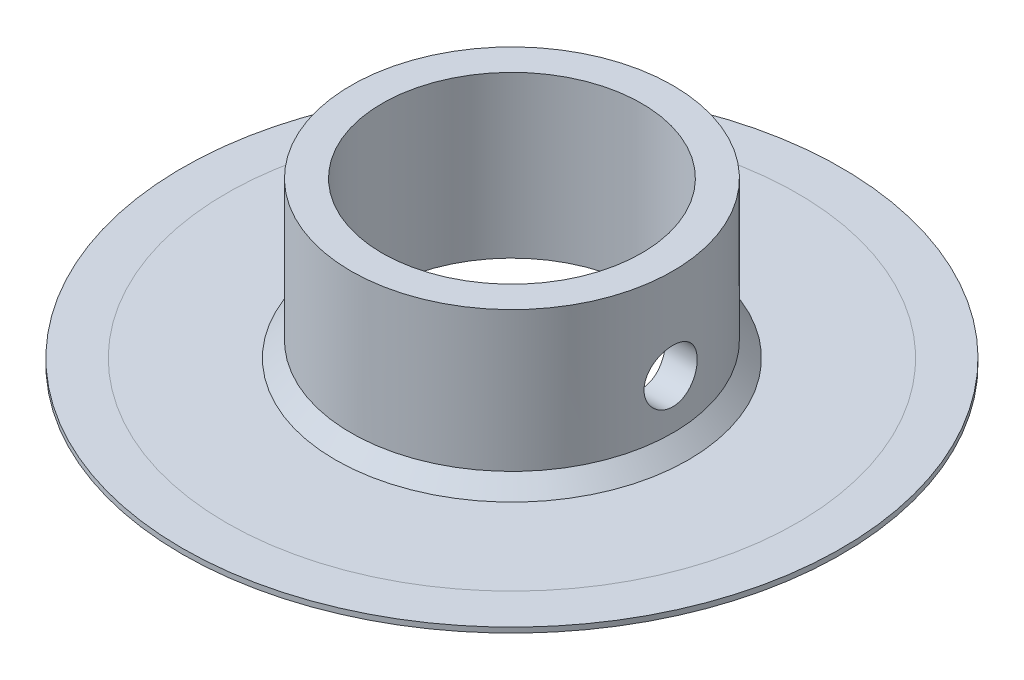
ISO-10303-21;
HEADER;
FILE_DESCRIPTION(('STEP AP214'),'2;1');
FILE_NAME('part.step','',(''),(''),'','','');
FILE_SCHEMA(('AUTOMOTIVE_DESIGN { 1 0 10303 214 1 1 1 1 }'));
ENDSEC;
DATA;
#1=APPLICATION_CONTEXT('core data for automotive mechanical design processes');
#2=APPLICATION_PROTOCOL_DEFINITION('international standard','automotive_design',2000,#1);
#3=PRODUCT_CONTEXT('',#1,'mechanical');
#4=PRODUCT('Part','Part','',(#3));
#5=PRODUCT_RELATED_PRODUCT_CATEGORY('part','',(#4));
#6=PRODUCT_DEFINITION_FORMATION('','',#4);
#7=PRODUCT_DEFINITION_CONTEXT('part definition',#1,'design');
#8=PRODUCT_DEFINITION('design','',#6,#7);
#9=PRODUCT_DEFINITION_SHAPE('','',#8);
#10=(LENGTH_UNIT() NAMED_UNIT(*) SI_UNIT(.MILLI.,.METRE.));
#11=(NAMED_UNIT(*) PLANE_ANGLE_UNIT() SI_UNIT($,.RADIAN.));
#12=(NAMED_UNIT(*) SI_UNIT($,.STERADIAN.) SOLID_ANGLE_UNIT());
#13=UNCERTAINTY_MEASURE_WITH_UNIT(LENGTH_MEASURE(1.E-05),#10,'distance_accuracy_value','');
#14=(GEOMETRIC_REPRESENTATION_CONTEXT(3) GLOBAL_UNCERTAINTY_ASSIGNED_CONTEXT((#13)) GLOBAL_UNIT_ASSIGNED_CONTEXT((#10,
#11,#12)) REPRESENTATION_CONTEXT('',''));
#15=CARTESIAN_POINT('',(0.,0.,0.));
#16=DIRECTION('',(0.,0.,1.));
#17=DIRECTION('',(1.,0.,0.));
#18=AXIS2_PLACEMENT_3D('',#15,#16,#17);
#19=CARTESIAN_POINT('',(0.,0.2,0.));
#20=DIRECTION('',(0.,1.,0.));
#21=DIRECTION('',(0.,0.,1.));
#22=AXIS2_PLACEMENT_3D('',#19,#20,#21);
#23=PLANE('',#22);
#24=CARTESIAN_POINT('',(0.,0.2,0.));
#25=DIRECTION('',(0.,1.,0.));
#26=DIRECTION('',(0.,0.,1.));
#27=AXIS2_PLACEMENT_3D('',#24,#25,#26);
#28=CIRCLE('',#27,12.7);
#29=CARTESIAN_POINT('',(0.,0.2,12.7));
#30=VERTEX_POINT('',#29);
#31=EDGE_CURVE('E55',#30,#30,#28,.T.);
#32=ORIENTED_EDGE('',*,*,#31,.T.);
#33=EDGE_LOOP('',(#32));
#34=FACE_BOUND('',#33,.T.);
#35=CARTESIAN_POINT('',(0.,0.2,0.));
#36=DIRECTION('',(0.,1.,0.));
#37=DIRECTION('',(0.,0.,1.));
#38=AXIS2_PLACEMENT_3D('',#35,#36,#37);
#39=CIRCLE('',#38,11.);
#40=CARTESIAN_POINT('',(0.,0.2,11.));
#41=VERTEX_POINT('',#40);
#42=EDGE_CURVE('E10',#41,#41,#39,.F.);
#43=ORIENTED_EDGE('',*,*,#42,.T.);
#44=EDGE_LOOP('',(#43));
#45=FACE_BOUND('',#44,.T.);
#46=ADVANCED_FACE('F37',(#34,#45),#23,.T.);
#47=CARTESIAN_POINT('',(0.,0.2,0.));
#48=DIRECTION('',(0.,-1.,0.));
#49=DIRECTION('',(0.,0.,-1.));
#50=AXIS2_PLACEMENT_3D('',#47,#48,#49);
#51=CYLINDRICAL_SURFACE('',#50,12.7);
#52=ORIENTED_EDGE('',*,*,#31,.F.);
#53=EDGE_LOOP('',(#52));
#54=FACE_BOUND('',#53,.T.);
#55=CARTESIAN_POINT('',(0.,0.,0.));
#56=DIRECTION('',(0.,1.,0.));
#57=DIRECTION('',(0.,0.,1.));
#58=AXIS2_PLACEMENT_3D('',#55,#56,#57);
#59=CIRCLE('',#58,12.7);
#60=CARTESIAN_POINT('',(0.,0.,12.7));
#61=VERTEX_POINT('',#60);
#62=EDGE_CURVE('E58',#61,#61,#59,.T.);
#63=ORIENTED_EDGE('',*,*,#62,.T.);
#64=EDGE_LOOP('',(#63));
#65=FACE_BOUND('',#64,.T.);
#66=ADVANCED_FACE('F110',(#54,#65),#51,.T.);
#67=ORIENTED_EDGE('',*,*,#42,.F.);
#68=EDGE_LOOP('',(#67));
#69=FACE_BOUND('',#68,.T.);
#70=CARTESIAN_POINT('',(0.,0.2,0.));
#71=DIRECTION('',(0.,1.,0.));
#72=DIRECTION('',(0.,0.,1.));
#73=AXIS2_PLACEMENT_3D('',#70,#71,#72);
#74=CIRCLE('',#73,6.79999999999999);
#75=CARTESIAN_POINT('',(0.,0.2,6.79999999999999));
#76=VERTEX_POINT('',#75);
#77=EDGE_CURVE('E45',#76,#76,#74,.F.);
#78=ORIENTED_EDGE('',*,*,#77,.T.);
#79=EDGE_LOOP('',(#78));
#80=FACE_BOUND('',#79,.T.);
#81=ADVANCED_FACE('F112',(#69,#80),#23,.T.);
#82=CARTESIAN_POINT('',(0.,0.,0.));
#83=DIRECTION('',(0.,1.,0.));
#84=DIRECTION('',(0.,0.,1.));
#85=AXIS2_PLACEMENT_3D('',#82,#83,#84);
#86=PLANE('',#85);
#87=CARTESIAN_POINT('',(0.,0.,0.));
#88=DIRECTION('',(0.,1.,0.));
#89=DIRECTION('',(0.,0.,1.));
#90=AXIS2_PLACEMENT_3D('',#87,#88,#89);
#91=CIRCLE('',#90,5.);
#92=CARTESIAN_POINT('',(0.,0.,5.));
#93=VERTEX_POINT('',#92);
#94=EDGE_CURVE('E66',#93,#93,#91,.T.);
#95=ORIENTED_EDGE('',*,*,#94,.T.);
#96=EDGE_LOOP('',(#95));
#97=FACE_BOUND('',#96,.T.);
#98=ORIENTED_EDGE('',*,*,#62,.F.);
#99=EDGE_LOOP('',(#98));
#100=FACE_BOUND('',#99,.T.);
#101=ADVANCED_FACE('F105',(#97,#100),#86,.F.);
#102=CARTESIAN_POINT('',(0.,6.2,0.));
#103=DIRECTION('',(0.,-1.,0.));
#104=DIRECTION('',(0.,0.,-1.));
#105=AXIS2_PLACEMENT_3D('',#102,#103,#104);
#106=CYLINDRICAL_SURFACE('',#105,6.2);
#107=CARTESIAN_POINT('',(6.11468519222372,2.7,-1.02499999999999));
#108=CARTESIAN_POINT('',(6.11468621834878,2.64284899857778,-1.02499769733902));
#109=CARTESIAN_POINT('',(6.11549511921186,2.58566662172223,-1.02020395573959));
#110=CARTESIAN_POINT('',(6.11864043632118,2.47290582598775,-1.00116370877257));
#111=CARTESIAN_POINT('',(6.12097826807639,2.41732894333744,-0.986908443591222));
#112=CARTESIAN_POINT('',(6.12690959263376,2.30942737988513,-0.949387751557226));
#113=CARTESIAN_POINT('',(6.13050204304009,2.25710004158844,-0.926129802822118));
#114=CARTESIAN_POINT('',(6.13853659287519,2.15709620096999,-0.871282490355476));
#115=CARTESIAN_POINT('',(6.14297859487991,2.10941916631093,-0.839694081779112));
#116=CARTESIAN_POINT('',(6.15225989704329,2.01960098294758,-0.768755625166493));
#117=CARTESIAN_POINT('',(6.15710231168028,1.97751148978985,-0.729340572496074));
#118=CARTESIAN_POINT('',(6.16661114251174,1.90051173656749,-0.644008145244442));
#119=CARTESIAN_POINT('',(6.17127754832712,1.86560189934132,-0.598090387961887));
#120=CARTESIAN_POINT('',(6.17994151048768,1.80375882295949,-0.500721606589131));
#121=CARTESIAN_POINT('',(6.18393497929933,1.77687361624094,-0.449239680284478));
#122=CARTESIAN_POINT('',(6.19076846692061,1.7321516666367,-0.342413412475257));
#123=CARTESIAN_POINT('',(6.19360855953399,1.71431434476489,-0.287069318373802));
#124=CARTESIAN_POINT('',(6.19779330823486,1.68835237391988,-0.174623264327099));
#125=CARTESIAN_POINT('',(6.19915131599478,1.68014095726412,-0.117541842627033));
#126=CARTESIAN_POINT('',(6.20026474756261,1.67339411093436,-0.00279635980400497));
#127=CARTESIAN_POINT('',(6.20002027862671,1.67485803367524,0.0548676620667046));
#128=CARTESIAN_POINT('',(6.19796687946073,1.68735257581307,0.168548328677381));
#129=CARTESIAN_POINT('',(6.19617321974376,1.69828981881294,0.224575551583191));
#130=CARTESIAN_POINT('',(6.19124000145266,1.7292735377972,0.333988399842735));
#131=CARTESIAN_POINT('',(6.18810040240485,1.74932028771429,0.387373945704855));
#132=CARTESIAN_POINT('',(6.18080205390846,1.79804700141481,0.490266132122608));
#133=CARTESIAN_POINT('',(6.17663876979775,1.82676551161131,0.539754183470166));
#134=CARTESIAN_POINT('',(6.16775571907501,1.89199230017465,0.633243985606351));
#135=CARTESIAN_POINT('',(6.16303590814382,1.92850119911906,0.677245298882126));
#136=CARTESIAN_POINT('',(6.15349832119461,2.00879050567103,0.759064172945987));
#137=CARTESIAN_POINT('',(6.14868004831722,2.05265251744915,0.796801641216312));
#138=CARTESIAN_POINT('',(6.13954312198001,2.14612781877588,0.864394108645959));
#139=CARTESIAN_POINT('',(6.13522447298674,2.19574115973235,0.894249037339917));
#140=CARTESIAN_POINT('',(6.12757554662004,2.29940287610074,0.945244286168177));
#141=CARTESIAN_POINT('',(6.12424635060234,2.35345602198297,0.966375081590494));
#142=CARTESIAN_POINT('',(6.118971273478,2.46441187593744,0.99923480234979));
#143=CARTESIAN_POINT('',(6.11702527264859,2.52131433693006,1.0109645414086));
#144=CARTESIAN_POINT('',(6.11476004437147,2.63563729353179,1.02457665174229));
#145=CARTESIAN_POINT('',(6.11442196571342,2.69304383992667,1.02657314219478));
#146=CARTESIAN_POINT('',(6.11536066251605,2.80737092610743,1.02096608203965));
#147=CARTESIAN_POINT('',(6.11663737664852,2.86429148426799,1.01336289601808));
#148=CARTESIAN_POINT('',(6.1206443969546,2.97566907502398,0.988869564701533));
#149=CARTESIAN_POINT('',(6.12336562410887,3.03013921458202,0.972037403642339));
#150=CARTESIAN_POINT('',(6.12994744861854,3.13548553328628,0.929624697128855));
#151=CARTESIAN_POINT('',(6.13380811314534,3.18636150033185,0.904043635900667));
#152=CARTESIAN_POINT('',(6.14227766547897,3.28358349713881,0.844589535580707));
#153=CARTESIAN_POINT('',(6.14689302980851,3.32988419286276,0.810643303393374));
#154=CARTESIAN_POINT('',(6.15633295540963,3.41617287956669,0.735523038828991));
#155=CARTESIAN_POINT('',(6.1611575311324,3.45616043358038,0.694348506558861));
#156=CARTESIAN_POINT('',(6.17053183913415,3.52910387591784,0.605435091854494));
#157=CARTESIAN_POINT('',(6.17507825739849,3.5619836988586,0.557633404058592));
#158=CARTESIAN_POINT('',(6.18333096339146,3.61924578306582,0.457118552207727));
#159=CARTESIAN_POINT('',(6.18703727795563,3.64362831577571,0.404405545111604));
#160=CARTESIAN_POINT('',(6.19317776137465,3.68308505344424,0.295791325830294));
#161=CARTESIAN_POINT('',(6.19561738369889,3.69819921318813,0.239904949709854));
#162=CARTESIAN_POINT('',(6.19897264523866,3.71881887918247,0.12634362045257));
#163=CARTESIAN_POINT('',(6.19988840775023,3.72432516281144,0.06866881240308));
#164=CARTESIAN_POINT('',(6.20009106808783,3.72555068972458,-0.0460977312736879));
#165=CARTESIAN_POINT('',(6.19939723706189,3.72138572322694,-0.103188229607228));
#166=CARTESIAN_POINT('',(6.19649797017694,3.70363723682134,-0.215844701731178));
#167=CARTESIAN_POINT('',(6.19429254245271,3.6900537675997,-0.271410683724206));
#168=CARTESIAN_POINT('',(6.18861699164192,3.65389801544683,-0.379397635323583));
#169=CARTESIAN_POINT('',(6.1851482325484,3.6313354246629,-0.431821926125598));
#170=CARTESIAN_POINT('',(6.17732487907575,3.57787474395315,-0.532158657610738));
#171=CARTESIAN_POINT('',(6.17297024379937,3.54697626917235,-0.580070889841226));
#172=CARTESIAN_POINT('',(6.1637961455635,3.47730973511736,-0.670607081239796));
#173=CARTESIAN_POINT('',(6.15897199268893,3.43845682400909,-0.713165279630289));
#174=CARTESIAN_POINT('',(6.14943523164716,3.35416243411005,-0.791198905655186));
#175=CARTESIAN_POINT('',(6.1447226498716,3.30871941421928,-0.82667267196658));
#176=CARTESIAN_POINT('',(6.13590726012375,3.21216017977479,-0.889756501126194));
#177=CARTESIAN_POINT('',(6.13180891576498,3.16100674604317,-0.917310221820288));
#178=CARTESIAN_POINT('',(6.12473874305774,3.05475088141037,-0.963391642796003));
#179=CARTESIAN_POINT('',(6.12176578628566,2.99965247241931,-0.981928389722952));
#180=CARTESIAN_POINT('',(6.11794465253936,2.90361388063432,-1.00540858799));
#181=CARTESIAN_POINT('',(6.11672912463853,2.86325623039843,-1.01274362660137));
#182=CARTESIAN_POINT('',(6.11509903369655,2.78193775616185,-1.02254011503201));
#183=CARTESIAN_POINT('',(6.11468445649789,2.74097694283549,-1.02500165099481));
#184=CARTESIAN_POINT('',(6.11468519222372,2.7,-1.02499999999999));
#185=B_SPLINE_CURVE_WITH_KNOTS('',3,(#107,#108,#109,#110,#111,#112,#113,#114,#115,#116,#117,
#118,#119,#120,#121,#122,#123,#124,#125,#126,#127,#128,#129,#130,#131,#132,#133,#134,#135,#136,
#137,#138,#139,#140,#141,#142,#143,#144,#145,#146,#147,#148,#149,#150,#151,#152,#153,#154,#155,
#156,#157,#158,#159,#160,#161,#162,#163,#164,#165,#166,#167,#168,#169,#170,#171,#172,#173,#174,
#175,#176,#177,#178,#179,#180,#181,#182,#183,#184),.UNSPECIFIED.,.T.,.F.,(4,2,2,2,2,2,2,2,2,2,2,
2,2,2,2,2,2,2,2,2,2,2,2,2,2,2,2,2,2,2,2,2,2,2,2,2,2,2,4),(0.,0.171303164784234,
0.342765149752583,0.514085013675939,0.685385242913409,0.858172679931962,1.03097029017688,
1.20478236501028,1.37858331597562,1.55080527988997,1.72301571684438,1.89354778511082,
2.06408498179985,2.23539167191349,2.40671201331029,2.58007757685421,2.75344469013395,
2.92700058238233,3.10054145063031,3.27204263271111,3.44353730154555,3.61396664100292,
3.78440602951326,3.95639324725802,4.12839236394347,4.30214986213834,4.47590180919209,
4.64889936904837,4.82188293092795,4.99280612201056,5.16372839326537,5.33446666767845,
5.50521282616501,5.67788534396803,5.85059830662917,6.02451112718896,6.19824910090722,
6.32107466642879,6.44389806087895),.UNSPECIFIED.);
#186=CARTESIAN_POINT('',(6.11468519222372,2.7,-1.02499999999999));
#187=VERTEX_POINT('',#186);
#188=EDGE_CURVE('E70',#187,#187,#185,.T.);
#189=ORIENTED_EDGE('',*,*,#188,.T.);
#190=EDGE_LOOP('',(#189));
#191=FACE_BOUND('',#190,.T.);
#192=CARTESIAN_POINT('',(0.,0.799999999999985,0.));
#193=DIRECTION('',(0.,-1.,0.));
#194=DIRECTION('',(0.,0.,-1.));
#195=AXIS2_PLACEMENT_3D('',#192,#193,#194);
#196=CIRCLE('',#195,6.2);
#197=CARTESIAN_POINT('',(0.,0.799999999999985,-6.2));
#198=VERTEX_POINT('',#197);
#199=EDGE_CURVE('E51',#198,#198,#196,.F.);
#200=ORIENTED_EDGE('',*,*,#199,.T.);
#201=EDGE_LOOP('',(#200));
#202=FACE_BOUND('',#201,.T.);
#203=CARTESIAN_POINT('',(0.,6.2,0.));
#204=DIRECTION('',(0.,1.,0.));
#205=DIRECTION('',(0.,0.,1.));
#206=AXIS2_PLACEMENT_3D('',#203,#204,#205);
#207=CIRCLE('',#206,6.2);
#208=CARTESIAN_POINT('',(0.,6.2,6.2));
#209=VERTEX_POINT('',#208);
#210=EDGE_CURVE('E61',#209,#209,#207,.T.);
#211=ORIENTED_EDGE('',*,*,#210,.F.);
#212=EDGE_LOOP('',(#211));
#213=FACE_BOUND('',#212,.T.);
#214=ADVANCED_FACE('F83',(#191,#202,#213),#106,.T.);
#215=CARTESIAN_POINT('',(0.,6.2,0.));
#216=DIRECTION('',(0.,1.,0.));
#217=DIRECTION('',(0.,0.,1.));
#218=AXIS2_PLACEMENT_3D('',#215,#216,#217);
#219=PLANE('',#218);
#220=CARTESIAN_POINT('',(0.,6.2,0.));
#221=DIRECTION('',(0.,1.,0.));
#222=DIRECTION('',(0.,0.,1.));
#223=AXIS2_PLACEMENT_3D('',#220,#221,#222);
#224=CIRCLE('',#223,5.);
#225=CARTESIAN_POINT('',(0.,6.2,5.));
#226=VERTEX_POINT('',#225);
#227=EDGE_CURVE('E67',#226,#226,#224,.T.);
#228=ORIENTED_EDGE('',*,*,#227,.F.);
#229=EDGE_LOOP('',(#228));
#230=FACE_BOUND('',#229,.T.);
#231=ORIENTED_EDGE('',*,*,#210,.T.);
#232=EDGE_LOOP('',(#231));
#233=FACE_BOUND('',#232,.T.);
#234=ADVANCED_FACE('F97',(#230,#233),#219,.T.);
#235=CARTESIAN_POINT('',(0.,1.,0.));
#236=DIRECTION('',(0.,-1.,0.));
#237=DIRECTION('',(0.,0.,-1.));
#238=AXIS2_PLACEMENT_3D('',#235,#236,#237);
#239=CONICAL_SURFACE('',#238,5.99999999999998,0.785398163397453);
#240=ORIENTED_EDGE('',*,*,#77,.F.);
#241=EDGE_LOOP('',(#240));
#242=FACE_BOUND('',#241,.T.);
#243=ORIENTED_EDGE('',*,*,#199,.F.);
#244=EDGE_LOOP('',(#243));
#245=FACE_BOUND('',#244,.T.);
#246=ADVANCED_FACE('F39',(#242,#245),#239,.T.);
#247=CARTESIAN_POINT('',(0.,0.,0.));
#248=DIRECTION('',(0.,1.,0.));
#249=DIRECTION('',(0.,0.,1.));
#250=AXIS2_PLACEMENT_3D('',#247,#248,#249);
#251=CYLINDRICAL_SURFACE('',#250,5.);
#252=CARTESIAN_POINT('',(4.89380986553421,2.7,-1.02499999999999));
#253=CARTESIAN_POINT('',(4.8938110057621,2.75692184364766,-1.02499793130721));
#254=CARTESIAN_POINT('',(4.89481378990575,2.81386942664678,-1.02024228549257));
#255=CARTESIAN_POINT('',(4.89871030405494,2.92615139358604,-1.00136248503081));
#256=CARTESIAN_POINT('',(4.9016055092218,2.98148448383301,-0.987231021709743));
#257=CARTESIAN_POINT('',(4.90894550175205,3.08889685398785,-0.95005802907127));
#258=CARTESIAN_POINT('',(4.91338870641792,3.14097939341962,-0.927025597617711));
#259=CARTESIAN_POINT('',(4.92332217241195,3.24054030217505,-0.872729687713656));
#260=CARTESIAN_POINT('',(4.92881238491396,3.28801888604388,-0.841466593066036));
#261=CARTESIAN_POINT('',(4.94031235217697,3.37773129029778,-0.771101871906856));
#262=CARTESIAN_POINT('',(4.94632805581705,3.41988678022481,-0.731901332944746));
#263=CARTESIAN_POINT('',(4.95814890174971,3.49707195425185,-0.646988147012741));
#264=CARTESIAN_POINT('',(4.96395402885357,3.53210112517197,-0.601275031462478));
#265=CARTESIAN_POINT('',(4.97476396692358,3.59434480073779,-0.50411391856832));
#266=CARTESIAN_POINT('',(4.97976094371786,3.62148463286862,-0.452617137848568));
#267=CARTESIAN_POINT('',(4.98832463455805,3.66669705714557,-0.345674729621281));
#268=CARTESIAN_POINT('',(4.99189148932217,3.68477054142757,-0.29022949125851));
#269=CARTESIAN_POINT('',(4.99715101783892,3.71109273237502,-0.177777387771844));
#270=CARTESIAN_POINT('',(4.99886891641,3.71947379119316,-0.12080270245156));
#271=CARTESIAN_POINT('',(5.0003241629717,3.72658638352546,-0.00623178721856188));
#272=CARTESIAN_POINT('',(5.00006171106104,3.72531889194905,0.0513643793111704));
#273=CARTESIAN_POINT('',(4.99760530469913,3.71327027901569,0.164633093683833));
#274=CARTESIAN_POINT('',(4.99544030031358,3.70263174577533,0.220321528339864));
#275=CARTESIAN_POINT('',(4.98945478299076,3.67236947551435,0.329105605994237));
#276=CARTESIAN_POINT('',(4.98563420148153,3.65274536632043,0.382201141496551));
#277=CARTESIAN_POINT('',(4.97671939611424,3.60493845906525,0.484696168674203));
#278=CARTESIAN_POINT('',(4.97161696816092,3.57670026948439,0.534069081240158));
#279=CARTESIAN_POINT('',(4.96070018656929,3.51250784698684,0.627428202203324));
#280=CARTESIAN_POINT('',(4.95488574711571,3.47655268358705,0.671413760008536));
#281=CARTESIAN_POINT('',(4.94306086217348,3.3971662374192,0.753596275428009));
#282=CARTESIAN_POINT('',(4.93704877703615,3.35361015921131,0.79167254313405));
#283=CARTESIAN_POINT('',(4.92560682850159,3.26066970620968,0.860000671649432));
#284=CARTESIAN_POINT('',(4.92017697726181,3.21128520975958,0.890252369094729));
#285=CARTESIAN_POINT('',(4.91051075816983,3.10791082322015,0.942117317518955));
#286=CARTESIAN_POINT('',(4.90627721277129,3.05391042702409,0.963710189096989));
#287=CARTESIAN_POINT('',(4.89952370117187,2.94294094211076,0.997480378760953));
#288=CARTESIAN_POINT('',(4.89700349927218,2.88597226289139,1.00965899196581));
#289=CARTESIAN_POINT('',(4.89400946662045,2.77177951842831,1.02407282354529));
#290=CARTESIAN_POINT('',(4.89349969494809,2.71457841702024,1.02648270187056));
#291=CARTESIAN_POINT('',(4.89448764317553,2.60059163331306,1.0217613948332));
#292=CARTESIAN_POINT('',(4.89598524308533,2.54380592638786,1.01463077975053));
#293=CARTESIAN_POINT('',(4.90078546195405,2.43285437170472,0.991181728225227));
#294=CARTESIAN_POINT('',(4.90406959125894,2.37866777105559,0.974957356125928));
#295=CARTESIAN_POINT('',(4.91205649685424,2.27378198027643,0.93388224578884));
#296=CARTESIAN_POINT('',(4.91675939500817,2.22308309017888,0.909030766507865));
#297=CARTESIAN_POINT('',(4.92713422401412,2.12584978427293,0.85101425816063));
#298=CARTESIAN_POINT('',(4.93281850602254,2.07938166064694,0.81774037847768));
#299=CARTESIAN_POINT('',(4.94448208465937,1.99262475565841,0.743967994365467));
#300=CARTESIAN_POINT('',(4.95046141321375,1.95233664496051,0.703468706853817));
#301=CARTESIAN_POINT('',(4.96215848749079,1.87841712074459,0.615609413260678));
#302=CARTESIAN_POINT('',(4.96787042981155,1.8449040585122,0.568148934280834));
#303=CARTESIAN_POINT('',(4.97828676453437,1.78632717948164,0.468170064192647));
#304=CARTESIAN_POINT('',(4.98299120058534,1.76126299661972,0.415651892345245));
#305=CARTESIAN_POINT('',(4.99083775785138,1.72046588602684,0.307352979081922));
#306=CARTESIAN_POINT('',(4.99398900987908,1.70467831513894,0.251593513328277));
#307=CARTESIAN_POINT('',(4.99841338544825,1.68271004090243,0.138142770383645));
#308=CARTESIAN_POINT('',(4.9996867472207,1.67652811896646,0.0804517391827648));
#309=CARTESIAN_POINT('',(5.00020586269,1.67399579417231,-0.0340958711692691));
#310=CARTESIAN_POINT('',(4.99948824625799,1.67746778197901,-0.0909484321440764));
#311=CARTESIAN_POINT('',(4.99618343039842,1.69375123738106,-0.203241527910223));
#312=CARTESIAN_POINT('',(4.99359625696532,1.70656257512138,-0.258682082323116));
#313=CARTESIAN_POINT('',(4.98684449635498,1.74108047926637,-0.366459800900815));
#314=CARTESIAN_POINT('',(4.98268387363761,1.76276470073734,-0.418804385488467));
#315=CARTESIAN_POINT('',(4.9732322308254,1.81438986484487,-0.519137255738028));
#316=CARTESIAN_POINT('',(4.96794111595186,1.84433149983132,-0.567125175663012));
#317=CARTESIAN_POINT('',(4.95669678565988,1.91221552093222,-0.658257706981348));
#318=CARTESIAN_POINT('',(4.95073390192543,1.95028442368959,-0.701306894202705));
#319=CARTESIAN_POINT('',(4.93887408682551,2.03308359539407,-0.780466985575891));
#320=CARTESIAN_POINT('',(4.93297717147691,2.07781544589473,-0.816576237753605));
#321=CARTESIAN_POINT('',(4.92184252811152,2.17328441079412,-0.881224957715412));
#322=CARTESIAN_POINT('',(4.91661310221792,2.2240843038619,-0.909673214873726));
#323=CARTESIAN_POINT('',(4.90750765665614,2.32983728454331,-0.957584488298918));
#324=CARTESIAN_POINT('',(4.90363043108421,2.38478661816376,-0.977055515552491));
#325=CARTESIAN_POINT('',(4.89842769582289,2.48320279997227,-1.00276080240565));
#326=CARTESIAN_POINT('',(4.89670693536613,2.52611505646851,-1.01108530767306));
#327=CARTESIAN_POINT('',(4.89439760428208,2.61267984464839,-1.02220559535319));
#328=CARTESIAN_POINT('',(4.8938089908072,2.65633234825332,-1.02500158699982));
#329=CARTESIAN_POINT('',(4.89380986553421,2.7,-1.02499999999999));
#330=B_SPLINE_CURVE_WITH_KNOTS('',3,(#252,#253,#254,#255,#256,#257,#258,#259,#260,#261,#262,
#263,#264,#265,#266,#267,#268,#269,#270,#271,#272,#273,#274,#275,#276,#277,#278,#279,#280,#281,
#282,#283,#284,#285,#286,#287,#288,#289,#290,#291,#292,#293,#294,#295,#296,#297,#298,#299,#300,
#301,#302,#303,#304,#305,#306,#307,#308,#309,#310,#311,#312,#313,#314,#315,#316,#317,#318,#319,
#320,#321,#322,#323,#324,#325,#326,#327,#328,#329),.UNSPECIFIED.,.T.,.F.,(4,2,2,2,2,2,2,2,2,2,2,
2,2,2,2,2,2,2,2,2,2,2,2,2,2,2,2,2,2,2,2,2,2,2,2,2,2,2,4),(0.,0.170605605362296,
0.341344358373171,0.511909055381116,0.682465800219444,0.855295577710591,1.02813779660306,
1.20256633689028,1.37697770990116,1.54897823848098,1.72096138800326,1.89037201984933,
2.05978966914401,2.23032055580433,2.40087201598788,2.57454521798099,2.74822204568975,
2.92230527302076,3.0963645474691,3.2672976270322,3.43822048958126,3.60740714183648,
3.77660833032596,3.94811913834877,4.11964854584378,4.29395542802686,4.4682547570622,
4.6415168213226,4.81475690349686,4.98483097023184,5.1549026722893,5.32454868652392,
5.49420892920032,5.66673292428862,5.83929793606318,6.0138347595485,6.18821552917603,
6.31910075095942,6.44998101912336),.UNSPECIFIED.);
#331=CARTESIAN_POINT('',(4.89380986553421,2.7,-1.02499999999999));
#332=VERTEX_POINT('',#331);
#333=EDGE_CURVE('E79',#332,#332,#330,.T.);
#334=ORIENTED_EDGE('',*,*,#333,.T.);
#335=EDGE_LOOP('',(#334));
#336=FACE_BOUND('',#335,.T.);
#337=ORIENTED_EDGE('',*,*,#94,.F.);
#338=EDGE_LOOP('',(#337));
#339=FACE_BOUND('',#338,.T.);
#340=ORIENTED_EDGE('',*,*,#227,.T.);
#341=EDGE_LOOP('',(#340));
#342=FACE_BOUND('',#341,.T.);
#343=ADVANCED_FACE('F90',(#336,#339,#342),#251,.F.);
#344=CARTESIAN_POINT('',(6.2,2.7,0.));
#345=DIRECTION('',(1.,0.,0.));
#346=DIRECTION('',(0.,0.,-1.));
#347=AXIS2_PLACEMENT_3D('',#344,#345,#346);
#348=CYLINDRICAL_SURFACE('',#347,1.02499999999999);
#349=ORIENTED_EDGE('',*,*,#333,.F.);
#350=EDGE_LOOP('',(#349));
#351=FACE_BOUND('',#350,.T.);
#352=ORIENTED_EDGE('',*,*,#188,.F.);
#353=EDGE_LOOP('',(#352));
#354=FACE_BOUND('',#353,.T.);
#355=ADVANCED_FACE('F87',(#351,#354),#348,.F.);
#356=CLOSED_SHELL('',(#46,#66,#81,#101,#214,#234,#246,#343,#355));
#357=MANIFOLD_SOLID_BREP('B2',#356);
#358=ADVANCED_BREP_SHAPE_REPRESENTATION('',(#18,#357),#14);
#359=SHAPE_DEFINITION_REPRESENTATION(#9,#358);
ENDSEC;
END-ISO-10303-21;
